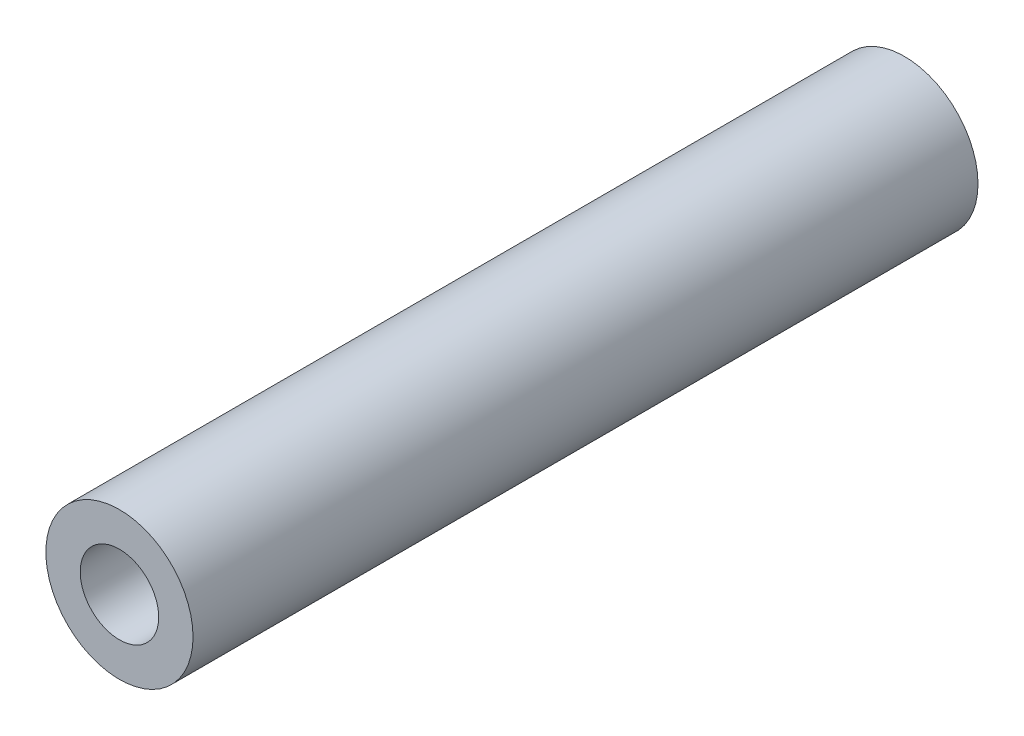
ISO-10303-21;
HEADER;
FILE_DESCRIPTION(('STEP AP214'),'2;1');
FILE_NAME('part.step','',(''),(''),'','','');
FILE_SCHEMA(('AUTOMOTIVE_DESIGN { 1 0 10303 214 1 1 1 1 }'));
ENDSEC;
DATA;
#1=APPLICATION_CONTEXT('core data for automotive mechanical design processes');
#2=APPLICATION_PROTOCOL_DEFINITION('international standard','automotive_design',2000,#1);
#3=PRODUCT_CONTEXT('',#1,'mechanical');
#4=PRODUCT('Part','Part','',(#3));
#5=PRODUCT_RELATED_PRODUCT_CATEGORY('part','',(#4));
#6=PRODUCT_DEFINITION_FORMATION('','',#4);
#7=PRODUCT_DEFINITION_CONTEXT('part definition',#1,'design');
#8=PRODUCT_DEFINITION('design','',#6,#7);
#9=PRODUCT_DEFINITION_SHAPE('','',#8);
#10=(LENGTH_UNIT() NAMED_UNIT(*) SI_UNIT(.MILLI.,.METRE.));
#11=(NAMED_UNIT(*) PLANE_ANGLE_UNIT() SI_UNIT($,.RADIAN.));
#12=(NAMED_UNIT(*) SI_UNIT($,.STERADIAN.) SOLID_ANGLE_UNIT());
#13=UNCERTAINTY_MEASURE_WITH_UNIT(LENGTH_MEASURE(1.E-05),#10,'distance_accuracy_value','');
#14=(GEOMETRIC_REPRESENTATION_CONTEXT(3) GLOBAL_UNCERTAINTY_ASSIGNED_CONTEXT((#13)) GLOBAL_UNIT_ASSIGNED_CONTEXT((#10,
#11,#12)) REPRESENTATION_CONTEXT('',''));
#15=CARTESIAN_POINT('',(0.,0.,0.));
#16=DIRECTION('',(0.,0.,1.));
#17=DIRECTION('',(1.,0.,0.));
#18=AXIS2_PLACEMENT_3D('',#15,#16,#17);
#19=CARTESIAN_POINT('',(0.,0.,0.));
#20=DIRECTION('',(0.,0.,1.));
#21=DIRECTION('',(1.,0.,0.));
#22=AXIS2_PLACEMENT_3D('',#19,#20,#21);
#23=CYLINDRICAL_SURFACE('',#22,2.54);
#24=CARTESIAN_POINT('',(0.,0.,0.));
#25=DIRECTION('',(0.,0.,1.));
#26=DIRECTION('',(1.,0.,0.));
#27=AXIS2_PLACEMENT_3D('',#24,#25,#26);
#28=CIRCLE('',#27,2.54);
#29=CARTESIAN_POINT('',(2.54,0.,0.));
#30=VERTEX_POINT('',#29);
#31=EDGE_CURVE('E18',#30,#30,#28,.F.);
#32=ORIENTED_EDGE('',*,*,#31,.T.);
#33=EDGE_LOOP('',(#32));
#34=FACE_BOUND('',#33,.T.);
#35=CARTESIAN_POINT('',(0.,0.,50.8000000007));
#36=DIRECTION('',(0.,0.,1.));
#37=DIRECTION('',(1.,0.,0.));
#38=AXIS2_PLACEMENT_3D('',#35,#36,#37);
#39=CIRCLE('',#38,2.54);
#40=CARTESIAN_POINT('',(2.54,0.,50.8000000007));
#41=VERTEX_POINT('',#40);
#42=EDGE_CURVE('E27',#41,#41,#39,.F.);
#43=ORIENTED_EDGE('',*,*,#42,.F.);
#44=EDGE_LOOP('',(#43));
#45=FACE_BOUND('',#44,.T.);
#46=ADVANCED_FACE('F15',(#34,#45),#23,.F.);
#47=CARTESIAN_POINT('',(0.,0.,0.));
#48=DIRECTION('',(0.,0.,1.));
#49=DIRECTION('',(1.,0.,0.));
#50=AXIS2_PLACEMENT_3D('',#47,#48,#49);
#51=PLANE('',#50);
#52=ORIENTED_EDGE('',*,*,#31,.F.);
#53=EDGE_LOOP('',(#52));
#54=FACE_BOUND('',#53,.T.);
#55=CARTESIAN_POINT('',(0.,0.,0.));
#56=DIRECTION('',(0.,0.,1.));
#57=DIRECTION('',(1.,0.,0.));
#58=AXIS2_PLACEMENT_3D('',#55,#56,#57);
#59=CIRCLE('',#58,4.7625);
#60=CARTESIAN_POINT('',(4.7625,0.,0.));
#61=VERTEX_POINT('',#60);
#62=EDGE_CURVE('E22',#61,#61,#59,.T.);
#63=ORIENTED_EDGE('',*,*,#62,.F.);
#64=EDGE_LOOP('',(#63));
#65=FACE_BOUND('',#64,.T.);
#66=ADVANCED_FACE('F37',(#54,#65),#51,.F.);
#67=CARTESIAN_POINT('',(0.,0.,50.8));
#68=DIRECTION('',(0.,0.,1.));
#69=DIRECTION('',(1.,0.,0.));
#70=AXIS2_PLACEMENT_3D('',#67,#68,#69);
#71=PLANE('',#70);
#72=ORIENTED_EDGE('',*,*,#42,.T.);
#73=EDGE_LOOP('',(#72));
#74=FACE_BOUND('',#73,.T.);
#75=CARTESIAN_POINT('',(0.,0.,50.8000000007));
#76=DIRECTION('',(0.,0.,1.));
#77=DIRECTION('',(1.,0.,0.));
#78=AXIS2_PLACEMENT_3D('',#75,#76,#77);
#79=CIRCLE('',#78,4.7625);
#80=CARTESIAN_POINT('',(4.7625,0.,50.8000000007));
#81=VERTEX_POINT('',#80);
#82=EDGE_CURVE('E10',#81,#81,#79,.F.);
#83=ORIENTED_EDGE('',*,*,#82,.F.);
#84=EDGE_LOOP('',(#83));
#85=FACE_BOUND('',#84,.T.);
#86=ADVANCED_FACE('F40',(#74,#85),#71,.T.);
#87=CARTESIAN_POINT('',(0.,0.,0.));
#88=DIRECTION('',(0.,0.,1.));
#89=DIRECTION('',(1.,0.,0.));
#90=AXIS2_PLACEMENT_3D('',#87,#88,#89);
#91=CYLINDRICAL_SURFACE('',#90,4.7625);
#92=ORIENTED_EDGE('',*,*,#62,.T.);
#93=EDGE_LOOP('',(#92));
#94=FACE_BOUND('',#93,.T.);
#95=ORIENTED_EDGE('',*,*,#82,.T.);
#96=EDGE_LOOP('',(#95));
#97=FACE_BOUND('',#96,.T.);
#98=ADVANCED_FACE('F43',(#94,#97),#91,.T.);
#99=CLOSED_SHELL('',(#46,#66,#86,#98));
#100=MANIFOLD_SOLID_BREP('B1',#99);
#101=ADVANCED_BREP_SHAPE_REPRESENTATION('',(#18,#100),#14);
#102=SHAPE_DEFINITION_REPRESENTATION(#9,#101);
ENDSEC;
END-ISO-10303-21;
